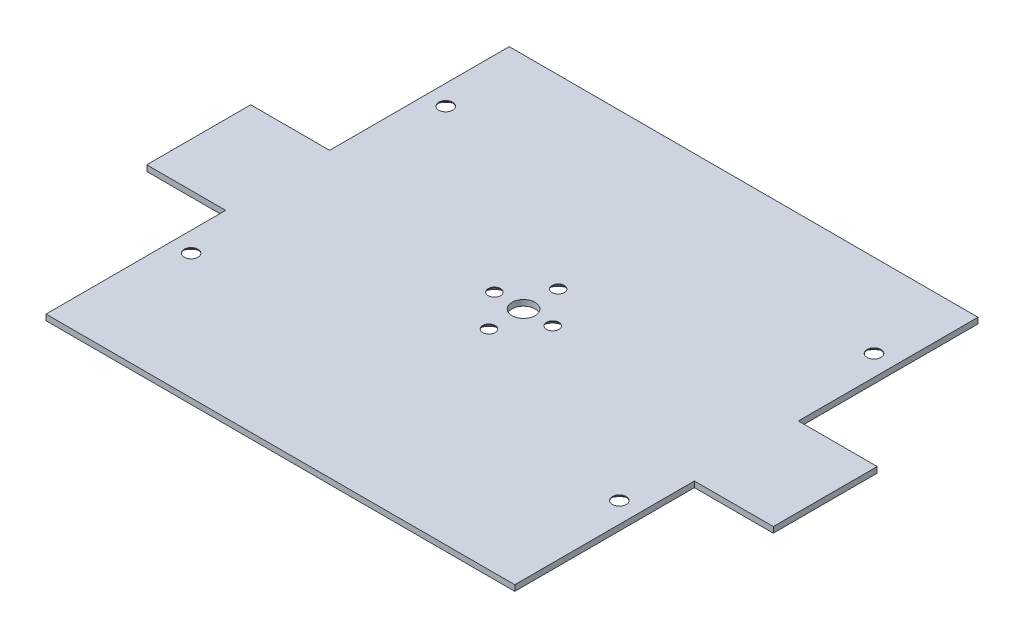
ISO-10303-21;
HEADER;
FILE_DESCRIPTION(('STEP AP214'),'2;1');
FILE_NAME('part.step','',(''),(''),'','','');
FILE_SCHEMA(('AUTOMOTIVE_DESIGN { 1 0 10303 214 1 1 1 1 }'));
ENDSEC;
DATA;
#1=APPLICATION_CONTEXT('core data for automotive mechanical design processes');
#2=APPLICATION_PROTOCOL_DEFINITION('international standard','automotive_design',2000,#1);
#3=PRODUCT_CONTEXT('',#1,'mechanical');
#4=PRODUCT('Part','Part','',(#3));
#5=PRODUCT_RELATED_PRODUCT_CATEGORY('part','',(#4));
#6=PRODUCT_DEFINITION_FORMATION('','',#4);
#7=PRODUCT_DEFINITION_CONTEXT('part definition',#1,'design');
#8=PRODUCT_DEFINITION('design','',#6,#7);
#9=PRODUCT_DEFINITION_SHAPE('','',#8);
#10=(LENGTH_UNIT() NAMED_UNIT(*) SI_UNIT(.MILLI.,.METRE.));
#11=(NAMED_UNIT(*) PLANE_ANGLE_UNIT() SI_UNIT($,.RADIAN.));
#12=(NAMED_UNIT(*) SI_UNIT($,.STERADIAN.) SOLID_ANGLE_UNIT());
#13=UNCERTAINTY_MEASURE_WITH_UNIT(LENGTH_MEASURE(1.E-05),#10,'distance_accuracy_value','');
#14=(GEOMETRIC_REPRESENTATION_CONTEXT(3) GLOBAL_UNCERTAINTY_ASSIGNED_CONTEXT((#13)) GLOBAL_UNIT_ASSIGNED_CONTEXT((#10,
#11,#12)) REPRESENTATION_CONTEXT('',''));
#15=CARTESIAN_POINT('',(0.,0.,0.));
#16=DIRECTION('',(0.,0.,1.));
#17=DIRECTION('',(1.,0.,0.));
#18=AXIS2_PLACEMENT_3D('',#15,#16,#17);
#19=CARTESIAN_POINT('',(-64.29375,1.5875,63.53175));
#20=DIRECTION('',(1.,0.,0.));
#21=DIRECTION('',(0.,0.,-1.));
#22=AXIS2_PLACEMENT_3D('',#19,#20,#21);
#23=PLANE('',#22);
#24=DIRECTION('',(0.,0.,1.));
#25=VECTOR('',#24,1.);
#26=CARTESIAN_POINT('',(-64.29375,0.,63.53175));
#27=LINE('',#26,#25);
#28=CARTESIAN_POINT('',(-64.29375,0.,14.25575));
#29=VERTEX_POINT('',#28);
#30=CARTESIAN_POINT('',(-64.29375,0.,63.53175));
#31=VERTEX_POINT('',#30);
#32=EDGE_CURVE('E212',#29,#31,#27,.T.);
#33=ORIENTED_EDGE('',*,*,#32,.T.);
#34=DIRECTION('',(0.,-1.,0.));
#35=VECTOR('',#34,1.);
#36=CARTESIAN_POINT('',(-64.29375,1.5875,63.53175));
#37=LINE('',#36,#35);
#38=CARTESIAN_POINT('',(-64.29375,1.5875,63.53175));
#39=VERTEX_POINT('',#38);
#40=EDGE_CURVE('E12',#39,#31,#37,.T.);
#41=ORIENTED_EDGE('',*,*,#40,.F.);
#42=DIRECTION('',(0.,0.,1.));
#43=VECTOR('',#42,1.);
#44=CARTESIAN_POINT('',(-64.29375,1.5875,63.53175));
#45=LINE('',#44,#43);
#46=CARTESIAN_POINT('',(-64.29375,1.5875,14.25575));
#47=VERTEX_POINT('',#46);
#48=EDGE_CURVE('E204',#47,#39,#45,.T.);
#49=ORIENTED_EDGE('',*,*,#48,.F.);
#50=DIRECTION('',(0.,-1.,0.));
#51=VECTOR('',#50,1.);
#52=CARTESIAN_POINT('',(-64.29375,1.5875,14.25575));
#53=LINE('',#52,#51);
#54=EDGE_CURVE('E157',#47,#29,#53,.T.);
#55=ORIENTED_EDGE('',*,*,#54,.T.);
#56=EDGE_LOOP('',(#33,#41,#49,#55));
#57=FACE_BOUND('',#56,.T.);
#58=ADVANCED_FACE('F38',(#57),#23,.F.);
#59=CARTESIAN_POINT('',(-64.29375,1.5875,63.53175));
#60=DIRECTION('',(0.,0.,-1.));
#61=DIRECTION('',(-1.,0.,0.));
#62=AXIS2_PLACEMENT_3D('',#59,#60,#61);
#63=PLANE('',#62);
#64=DIRECTION('',(1.,0.,0.));
#65=VECTOR('',#64,1.);
#66=CARTESIAN_POINT('',(-64.29375,0.,63.53175));
#67=LINE('',#66,#65);
#68=CARTESIAN_POINT('',(64.29375,0.,63.53175));
#69=VERTEX_POINT('',#68);
#70=EDGE_CURVE('E273',#31,#69,#67,.T.);
#71=ORIENTED_EDGE('',*,*,#70,.T.);
#72=DIRECTION('',(0.,-1.,0.));
#73=VECTOR('',#72,1.);
#74=CARTESIAN_POINT('',(64.29375,1.5875,63.53175));
#75=LINE('',#74,#73);
#76=CARTESIAN_POINT('',(64.29375,1.5875,63.53175));
#77=VERTEX_POINT('',#76);
#78=EDGE_CURVE('E46',#77,#69,#75,.T.);
#79=ORIENTED_EDGE('',*,*,#78,.F.);
#80=DIRECTION('',(1.,0.,0.));
#81=VECTOR('',#80,1.);
#82=CARTESIAN_POINT('',(-64.29375,1.5875,63.53175));
#83=LINE('',#82,#81);
#84=EDGE_CURVE('E109',#39,#77,#83,.T.);
#85=ORIENTED_EDGE('',*,*,#84,.F.);
#86=ORIENTED_EDGE('',*,*,#40,.T.);
#87=EDGE_LOOP('',(#71,#79,#85,#86));
#88=FACE_BOUND('',#87,.T.);
#89=ADVANCED_FACE('F262',(#88),#63,.F.);
#90=CARTESIAN_POINT('',(64.29375,1.5875,63.53175));
#91=DIRECTION('',(-1.,0.,0.));
#92=DIRECTION('',(0.,0.,1.));
#93=AXIS2_PLACEMENT_3D('',#90,#91,#92);
#94=PLANE('',#93);
#95=DIRECTION('',(0.,0.,-1.));
#96=VECTOR('',#95,1.);
#97=CARTESIAN_POINT('',(64.29375,0.,63.53175));
#98=LINE('',#97,#96);
#99=CARTESIAN_POINT('',(64.29375,0.,14.25575));
#100=VERTEX_POINT('',#99);
#101=EDGE_CURVE('E274',#69,#100,#98,.T.);
#102=ORIENTED_EDGE('',*,*,#101,.T.);
#103=DIRECTION('',(0.,-1.,0.));
#104=VECTOR('',#103,1.);
#105=CARTESIAN_POINT('',(64.29375,1.5875,14.25575));
#106=LINE('',#105,#104);
#107=CARTESIAN_POINT('',(64.29375,1.5875,14.25575));
#108=VERTEX_POINT('',#107);
#109=EDGE_CURVE('E311',#108,#100,#106,.T.);
#110=ORIENTED_EDGE('',*,*,#109,.F.);
#111=DIRECTION('',(0.,0.,-1.));
#112=VECTOR('',#111,1.);
#113=CARTESIAN_POINT('',(64.29375,1.5875,63.53175));
#114=LINE('',#113,#112);
#115=EDGE_CURVE('E193',#77,#108,#114,.T.);
#116=ORIENTED_EDGE('',*,*,#115,.F.);
#117=ORIENTED_EDGE('',*,*,#78,.T.);
#118=EDGE_LOOP('',(#102,#110,#116,#117));
#119=FACE_BOUND('',#118,.T.);
#120=ADVANCED_FACE('F267',(#119),#94,.F.);
#121=CARTESIAN_POINT('',(85.931375,1.5875,14.25575));
#122=DIRECTION('',(0.,0.,-1.));
#123=DIRECTION('',(-1.,0.,0.));
#124=AXIS2_PLACEMENT_3D('',#121,#122,#123);
#125=PLANE('',#124);
#126=DIRECTION('',(1.,0.,0.));
#127=VECTOR('',#126,1.);
#128=CARTESIAN_POINT('',(85.931375,0.,14.25575));
#129=LINE('',#128,#127);
#130=CARTESIAN_POINT('',(85.931375,0.,14.25575));
#131=VERTEX_POINT('',#130);
#132=EDGE_CURVE('E278',#100,#131,#129,.T.);
#133=ORIENTED_EDGE('',*,*,#132,.T.);
#134=DIRECTION('',(0.,-1.,0.));
#135=VECTOR('',#134,1.);
#136=CARTESIAN_POINT('',(85.931375,1.5875,14.25575));
#137=LINE('',#136,#135);
#138=CARTESIAN_POINT('',(85.931375,1.5875,14.25575));
#139=VERTEX_POINT('',#138);
#140=EDGE_CURVE('E308',#139,#131,#137,.T.);
#141=ORIENTED_EDGE('',*,*,#140,.F.);
#142=DIRECTION('',(1.,0.,0.));
#143=VECTOR('',#142,1.);
#144=CARTESIAN_POINT('',(85.931375,1.5875,14.25575));
#145=LINE('',#144,#143);
#146=EDGE_CURVE('E189',#108,#139,#145,.T.);
#147=ORIENTED_EDGE('',*,*,#146,.F.);
#148=ORIENTED_EDGE('',*,*,#109,.T.);
#149=EDGE_LOOP('',(#133,#141,#147,#148));
#150=FACE_BOUND('',#149,.T.);
#151=ADVANCED_FACE('F324',(#150),#125,.F.);
#152=CARTESIAN_POINT('',(85.931375,1.5875,-14.25575));
#153=DIRECTION('',(-1.,0.,0.));
#154=DIRECTION('',(0.,0.,1.));
#155=AXIS2_PLACEMENT_3D('',#152,#153,#154);
#156=PLANE('',#155);
#157=DIRECTION('',(0.,0.,-1.));
#158=VECTOR('',#157,1.);
#159=CARTESIAN_POINT('',(85.931375,0.,-14.25575));
#160=LINE('',#159,#158);
#161=CARTESIAN_POINT('',(85.931375,0.,-14.25575));
#162=VERTEX_POINT('',#161);
#163=EDGE_CURVE('E280',#131,#162,#160,.T.);
#164=ORIENTED_EDGE('',*,*,#163,.T.);
#165=DIRECTION('',(0.,-1.,0.));
#166=VECTOR('',#165,1.);
#167=CARTESIAN_POINT('',(85.931375,1.5875,-14.25575));
#168=LINE('',#167,#166);
#169=CARTESIAN_POINT('',(85.931375,1.5875,-14.25575));
#170=VERTEX_POINT('',#169);
#171=EDGE_CURVE('E305',#170,#162,#168,.T.);
#172=ORIENTED_EDGE('',*,*,#171,.F.);
#173=DIRECTION('',(0.,0.,-1.));
#174=VECTOR('',#173,1.);
#175=CARTESIAN_POINT('',(85.931375,1.5875,-14.25575));
#176=LINE('',#175,#174);
#177=EDGE_CURVE('E186',#139,#170,#176,.T.);
#178=ORIENTED_EDGE('',*,*,#177,.F.);
#179=ORIENTED_EDGE('',*,*,#140,.T.);
#180=EDGE_LOOP('',(#164,#172,#178,#179));
#181=FACE_BOUND('',#180,.T.);
#182=ADVANCED_FACE('F328',(#181),#156,.F.);
#183=CARTESIAN_POINT('',(85.931375,1.5875,-14.25575));
#184=DIRECTION('',(0.,0.,1.));
#185=DIRECTION('',(1.,0.,0.));
#186=AXIS2_PLACEMENT_3D('',#183,#184,#185);
#187=PLANE('',#186);
#188=DIRECTION('',(-1.,0.,0.));
#189=VECTOR('',#188,1.);
#190=CARTESIAN_POINT('',(85.931375,0.,-14.25575));
#191=LINE('',#190,#189);
#192=CARTESIAN_POINT('',(64.29375,0.,-14.25575));
#193=VERTEX_POINT('',#192);
#194=EDGE_CURVE('E282',#162,#193,#191,.T.);
#195=ORIENTED_EDGE('',*,*,#194,.T.);
#196=DIRECTION('',(0.,-1.,0.));
#197=VECTOR('',#196,1.);
#198=CARTESIAN_POINT('',(64.29375,1.5875,-14.25575));
#199=LINE('',#198,#197);
#200=CARTESIAN_POINT('',(64.29375,1.5875,-14.25575));
#201=VERTEX_POINT('',#200);
#202=EDGE_CURVE('E302',#201,#193,#199,.T.);
#203=ORIENTED_EDGE('',*,*,#202,.F.);
#204=DIRECTION('',(-1.,0.,0.));
#205=VECTOR('',#204,1.);
#206=CARTESIAN_POINT('',(85.931375,1.5875,-14.25575));
#207=LINE('',#206,#205);
#208=EDGE_CURVE('E178',#170,#201,#207,.T.);
#209=ORIENTED_EDGE('',*,*,#208,.F.);
#210=ORIENTED_EDGE('',*,*,#171,.T.);
#211=EDGE_LOOP('',(#195,#203,#209,#210));
#212=FACE_BOUND('',#211,.T.);
#213=ADVANCED_FACE('F511',(#212),#187,.F.);
#214=CARTESIAN_POINT('',(64.29375,1.5875,-63.53175));
#215=DIRECTION('',(-1.,0.,0.));
#216=DIRECTION('',(0.,0.,1.));
#217=AXIS2_PLACEMENT_3D('',#214,#215,#216);
#218=PLANE('',#217);
#219=DIRECTION('',(0.,0.,-1.));
#220=VECTOR('',#219,1.);
#221=CARTESIAN_POINT('',(64.29375,0.,-63.53175));
#222=LINE('',#221,#220);
#223=CARTESIAN_POINT('',(64.29375,0.,-63.53175));
#224=VERTEX_POINT('',#223);
#225=EDGE_CURVE('E284',#193,#224,#222,.T.);
#226=ORIENTED_EDGE('',*,*,#225,.T.);
#227=DIRECTION('',(0.,-1.,0.));
#228=VECTOR('',#227,1.);
#229=CARTESIAN_POINT('',(64.29375,1.5875,-63.53175));
#230=LINE('',#229,#228);
#231=CARTESIAN_POINT('',(64.29375,1.5875,-63.53175));
#232=VERTEX_POINT('',#231);
#233=EDGE_CURVE('E299',#232,#224,#230,.T.);
#234=ORIENTED_EDGE('',*,*,#233,.F.);
#235=DIRECTION('',(0.,0.,-1.));
#236=VECTOR('',#235,1.);
#237=CARTESIAN_POINT('',(64.29375,1.5875,-63.53175));
#238=LINE('',#237,#236);
#239=EDGE_CURVE('E174',#201,#232,#238,.T.);
#240=ORIENTED_EDGE('',*,*,#239,.F.);
#241=ORIENTED_EDGE('',*,*,#202,.T.);
#242=EDGE_LOOP('',(#226,#234,#240,#241));
#243=FACE_BOUND('',#242,.T.);
#244=ADVANCED_FACE('F507',(#243),#218,.F.);
#245=CARTESIAN_POINT('',(-64.29375,1.5875,-63.53175));
#246=DIRECTION('',(0.,0.,1.));
#247=DIRECTION('',(1.,0.,0.));
#248=AXIS2_PLACEMENT_3D('',#245,#246,#247);
#249=PLANE('',#248);
#250=DIRECTION('',(-1.,0.,0.));
#251=VECTOR('',#250,1.);
#252=CARTESIAN_POINT('',(-64.29375,0.,-63.53175));
#253=LINE('',#252,#251);
#254=CARTESIAN_POINT('',(-64.29375,0.,-63.53175));
#255=VERTEX_POINT('',#254);
#256=EDGE_CURVE('E286',#224,#255,#253,.T.);
#257=ORIENTED_EDGE('',*,*,#256,.T.);
#258=DIRECTION('',(0.,-1.,0.));
#259=VECTOR('',#258,1.);
#260=CARTESIAN_POINT('',(-64.29375,1.5875,-63.53175));
#261=LINE('',#260,#259);
#262=CARTESIAN_POINT('',(-64.29375,1.5875,-63.53175));
#263=VERTEX_POINT('',#262);
#264=EDGE_CURVE('E296',#263,#255,#261,.T.);
#265=ORIENTED_EDGE('',*,*,#264,.F.);
#266=DIRECTION('',(-1.,0.,0.));
#267=VECTOR('',#266,1.);
#268=CARTESIAN_POINT('',(-64.29375,1.5875,-63.53175));
#269=LINE('',#268,#267);
#270=EDGE_CURVE('E170',#232,#263,#269,.T.);
#271=ORIENTED_EDGE('',*,*,#270,.F.);
#272=ORIENTED_EDGE('',*,*,#233,.T.);
#273=EDGE_LOOP('',(#257,#265,#271,#272));
#274=FACE_BOUND('',#273,.T.);
#275=ADVANCED_FACE('F503',(#274),#249,.F.);
#276=CARTESIAN_POINT('',(-64.29375,1.5875,-63.53175));
#277=DIRECTION('',(1.,0.,0.));
#278=DIRECTION('',(0.,0.,-1.));
#279=AXIS2_PLACEMENT_3D('',#276,#277,#278);
#280=PLANE('',#279);
#281=DIRECTION('',(0.,0.,1.));
#282=VECTOR('',#281,1.);
#283=CARTESIAN_POINT('',(-64.29375,0.,-63.53175));
#284=LINE('',#283,#282);
#285=CARTESIAN_POINT('',(-64.29375,0.,-14.25575));
#286=VERTEX_POINT('',#285);
#287=EDGE_CURVE('E288',#255,#286,#284,.T.);
#288=ORIENTED_EDGE('',*,*,#287,.T.);
#289=DIRECTION('',(0.,-1.,0.));
#290=VECTOR('',#289,1.);
#291=CARTESIAN_POINT('',(-64.29375,1.5875,-14.25575));
#292=LINE('',#291,#290);
#293=CARTESIAN_POINT('',(-64.29375,1.5875,-14.25575));
#294=VERTEX_POINT('',#293);
#295=EDGE_CURVE('E150',#294,#286,#292,.T.);
#296=ORIENTED_EDGE('',*,*,#295,.F.);
#297=DIRECTION('',(0.,0.,1.));
#298=VECTOR('',#297,1.);
#299=CARTESIAN_POINT('',(-64.29375,1.5875,-63.53175));
#300=LINE('',#299,#298);
#301=EDGE_CURVE('E140',#263,#294,#300,.T.);
#302=ORIENTED_EDGE('',*,*,#301,.F.);
#303=ORIENTED_EDGE('',*,*,#264,.T.);
#304=EDGE_LOOP('',(#288,#296,#302,#303));
#305=FACE_BOUND('',#304,.T.);
#306=ADVANCED_FACE('F500',(#305),#280,.F.);
#307=CARTESIAN_POINT('',(-85.931375,1.5875,-14.25575));
#308=DIRECTION('',(0.,0.,1.));
#309=DIRECTION('',(1.,0.,0.));
#310=AXIS2_PLACEMENT_3D('',#307,#308,#309);
#311=PLANE('',#310);
#312=DIRECTION('',(-1.,0.,0.));
#313=VECTOR('',#312,1.);
#314=CARTESIAN_POINT('',(-85.931375,0.,-14.25575));
#315=LINE('',#314,#313);
#316=CARTESIAN_POINT('',(-85.931375,0.,-14.25575));
#317=VERTEX_POINT('',#316);
#318=EDGE_CURVE('E149',#286,#317,#315,.T.);
#319=ORIENTED_EDGE('',*,*,#318,.T.);
#320=DIRECTION('',(0.,-1.,0.));
#321=VECTOR('',#320,1.);
#322=CARTESIAN_POINT('',(-85.931375,1.5875,-14.25575));
#323=LINE('',#322,#321);
#324=CARTESIAN_POINT('',(-85.931375,1.5875,-14.25575));
#325=VERTEX_POINT('',#324);
#326=EDGE_CURVE('E146',#325,#317,#323,.T.);
#327=ORIENTED_EDGE('',*,*,#326,.F.);
#328=DIRECTION('',(-1.,0.,0.));
#329=VECTOR('',#328,1.);
#330=CARTESIAN_POINT('',(-85.931375,1.5875,-14.25575));
#331=LINE('',#330,#329);
#332=EDGE_CURVE('E134',#294,#325,#331,.T.);
#333=ORIENTED_EDGE('',*,*,#332,.F.);
#334=ORIENTED_EDGE('',*,*,#295,.T.);
#335=EDGE_LOOP('',(#319,#327,#333,#334));
#336=FACE_BOUND('',#335,.T.);
#337=ADVANCED_FACE('F147',(#336),#311,.F.);
#338=CARTESIAN_POINT('',(-85.931375,1.5875,-14.25575));
#339=DIRECTION('',(1.,0.,0.));
#340=DIRECTION('',(0.,0.,-1.));
#341=AXIS2_PLACEMENT_3D('',#338,#339,#340);
#342=PLANE('',#341);
#343=DIRECTION('',(0.,0.,1.));
#344=VECTOR('',#343,1.);
#345=CARTESIAN_POINT('',(-85.931375,0.,-14.25575));
#346=LINE('',#345,#344);
#347=CARTESIAN_POINT('',(-85.931375,0.,14.25575));
#348=VERTEX_POINT('',#347);
#349=EDGE_CURVE('E95',#317,#348,#346,.T.);
#350=ORIENTED_EDGE('',*,*,#349,.T.);
#351=DIRECTION('',(0.,-1.,0.));
#352=VECTOR('',#351,1.);
#353=CARTESIAN_POINT('',(-85.931375,1.5875,14.25575));
#354=LINE('',#353,#352);
#355=CARTESIAN_POINT('',(-85.931375,1.5875,14.25575));
#356=VERTEX_POINT('',#355);
#357=EDGE_CURVE('E151',#356,#348,#354,.T.);
#358=ORIENTED_EDGE('',*,*,#357,.F.);
#359=DIRECTION('',(0.,0.,1.));
#360=VECTOR('',#359,1.);
#361=CARTESIAN_POINT('',(-85.931375,1.5875,-14.25575));
#362=LINE('',#361,#360);
#363=EDGE_CURVE('E138',#325,#356,#362,.T.);
#364=ORIENTED_EDGE('',*,*,#363,.F.);
#365=ORIENTED_EDGE('',*,*,#326,.T.);
#366=EDGE_LOOP('',(#350,#358,#364,#365));
#367=FACE_BOUND('',#366,.T.);
#368=ADVANCED_FACE('F153',(#367),#342,.F.);
#369=CARTESIAN_POINT('',(-85.931375,1.5875,14.25575));
#370=DIRECTION('',(0.,0.,-1.));
#371=DIRECTION('',(-1.,0.,0.));
#372=AXIS2_PLACEMENT_3D('',#369,#370,#371);
#373=PLANE('',#372);
#374=DIRECTION('',(1.,0.,0.));
#375=VECTOR('',#374,1.);
#376=CARTESIAN_POINT('',(-85.931375,0.,14.25575));
#377=LINE('',#376,#375);
#378=EDGE_CURVE('E101',#348,#29,#377,.T.);
#379=ORIENTED_EDGE('',*,*,#378,.T.);
#380=ORIENTED_EDGE('',*,*,#54,.F.);
#381=DIRECTION('',(1.,0.,0.));
#382=VECTOR('',#381,1.);
#383=CARTESIAN_POINT('',(-85.931375,1.5875,14.25575));
#384=LINE('',#383,#382);
#385=EDGE_CURVE('E54',#356,#47,#384,.T.);
#386=ORIENTED_EDGE('',*,*,#385,.F.);
#387=ORIENTED_EDGE('',*,*,#357,.T.);
#388=EDGE_LOOP('',(#379,#380,#386,#387));
#389=FACE_BOUND('',#388,.T.);
#390=ADVANCED_FACE('F492',(#389),#373,.F.);
#391=CARTESIAN_POINT('',(0.,1.5875,0.));
#392=DIRECTION('',(0.,-1.,0.));
#393=DIRECTION('',(0.,0.,-1.));
#394=AXIS2_PLACEMENT_3D('',#391,#392,#393);
#395=PLANE('',#394);
#396=CARTESIAN_POINT('',(8.,1.5875,-3.175));
#397=DIRECTION('',(0.,-1.,0.));
#398=DIRECTION('',(0.,0.,-1.));
#399=AXIS2_PLACEMENT_3D('',#396,#397,#398);
#400=CIRCLE('',#399,1.7);
#401=CARTESIAN_POINT('',(8.,1.5875,-4.875));
#402=VERTEX_POINT('',#401);
#403=EDGE_CURVE('E363',#402,#402,#400,.T.);
#404=ORIENTED_EDGE('',*,*,#403,.T.);
#405=EDGE_LOOP('',(#404));
#406=FACE_BOUND('',#405,.T.);
#407=CARTESIAN_POINT('',(-8.,1.5875,-3.175));
#408=DIRECTION('',(0.,-1.,0.));
#409=DIRECTION('',(0.,0.,-1.));
#410=AXIS2_PLACEMENT_3D('',#407,#408,#409);
#411=CIRCLE('',#410,1.7);
#412=CARTESIAN_POINT('',(-8.,1.5875,-4.875));
#413=VERTEX_POINT('',#412);
#414=EDGE_CURVE('E357',#413,#413,#411,.T.);
#415=ORIENTED_EDGE('',*,*,#414,.T.);
#416=EDGE_LOOP('',(#415));
#417=FACE_BOUND('',#416,.T.);
#418=CARTESIAN_POINT('',(0.,1.5875,-12.675));
#419=DIRECTION('',(0.,-1.,0.));
#420=DIRECTION('',(0.,0.,-1.));
#421=AXIS2_PLACEMENT_3D('',#418,#419,#420);
#422=CIRCLE('',#421,1.7);
#423=CARTESIAN_POINT('',(0.,1.5875,-14.375));
#424=VERTEX_POINT('',#423);
#425=EDGE_CURVE('E351',#424,#424,#422,.T.);
#426=ORIENTED_EDGE('',*,*,#425,.T.);
#427=EDGE_LOOP('',(#426));
#428=FACE_BOUND('',#427,.T.);
#429=CARTESIAN_POINT('',(0.,1.5875,6.325));
#430=DIRECTION('',(0.,-1.,0.));
#431=DIRECTION('',(0.,0.,-1.));
#432=AXIS2_PLACEMENT_3D('',#429,#430,#431);
#433=CIRCLE('',#432,1.7);
#434=CARTESIAN_POINT('',(0.,1.5875,4.625));
#435=VERTEX_POINT('',#434);
#436=EDGE_CURVE('E346',#435,#435,#433,.T.);
#437=ORIENTED_EDGE('',*,*,#436,.T.);
#438=EDGE_LOOP('',(#437));
#439=FACE_BOUND('',#438,.T.);
#440=CARTESIAN_POINT('',(0.,1.5875,-3.175));
#441=DIRECTION('',(0.,-1.,0.));
#442=DIRECTION('',(0.,0.,-1.));
#443=AXIS2_PLACEMENT_3D('',#440,#441,#442);
#444=CIRCLE('',#443,3.175);
#445=CARTESIAN_POINT('',(0.,1.5875,-6.35));
#446=VERTEX_POINT('',#445);
#447=EDGE_CURVE('E340',#446,#446,#444,.T.);
#448=ORIENTED_EDGE('',*,*,#447,.T.);
#449=EDGE_LOOP('',(#448));
#450=FACE_BOUND('',#449,.T.);
#451=CARTESIAN_POINT('',(-58.8486249999998,1.5875,29.17825));
#452=DIRECTION('',(0.,-1.,0.));
#453=DIRECTION('',(0.,0.,-1.));
#454=AXIS2_PLACEMENT_3D('',#451,#452,#453);
#455=CIRCLE('',#454,1.89865);
#456=CARTESIAN_POINT('',(-58.8486249999998,1.5875,27.2796));
#457=VERTEX_POINT('',#456);
#458=EDGE_CURVE('E335',#457,#457,#455,.T.);
#459=ORIENTED_EDGE('',*,*,#458,.T.);
#460=EDGE_LOOP('',(#459));
#461=FACE_BOUND('',#460,.T.);
#462=CARTESIAN_POINT('',(-58.8486249999998,1.5875,-40.67175));
#463=DIRECTION('',(0.,-1.,0.));
#464=DIRECTION('',(0.,0.,-1.));
#465=AXIS2_PLACEMENT_3D('',#462,#463,#464);
#466=CIRCLE('',#465,1.89865);
#467=CARTESIAN_POINT('',(-58.8486249999998,1.5875,-42.5704));
#468=VERTEX_POINT('',#467);
#469=EDGE_CURVE('E231',#468,#468,#466,.T.);
#470=ORIENTED_EDGE('',*,*,#469,.T.);
#471=EDGE_LOOP('',(#470));
#472=FACE_BOUND('',#471,.T.);
#473=CARTESIAN_POINT('',(58.6263750000002,1.5875,-40.67175));
#474=DIRECTION('',(0.,-1.,0.));
#475=DIRECTION('',(0.,0.,-1.));
#476=AXIS2_PLACEMENT_3D('',#473,#474,#475);
#477=CIRCLE('',#476,1.89865);
#478=CARTESIAN_POINT('',(58.6263750000002,1.5875,-42.5704));
#479=VERTEX_POINT('',#478);
#480=EDGE_CURVE('E219',#479,#479,#477,.T.);
#481=ORIENTED_EDGE('',*,*,#480,.T.);
#482=EDGE_LOOP('',(#481));
#483=FACE_BOUND('',#482,.T.);
#484=CARTESIAN_POINT('',(58.6263750000002,1.5875,29.17825));
#485=DIRECTION('',(0.,-1.,0.));
#486=DIRECTION('',(0.,0.,-1.));
#487=AXIS2_PLACEMENT_3D('',#484,#485,#486);
#488=CIRCLE('',#487,1.89865);
#489=CARTESIAN_POINT('',(58.6263750000002,1.5875,27.2796));
#490=VERTEX_POINT('',#489);
#491=EDGE_CURVE('E207',#490,#490,#488,.T.);
#492=ORIENTED_EDGE('',*,*,#491,.T.);
#493=EDGE_LOOP('',(#492));
#494=FACE_BOUND('',#493,.T.);
#495=ORIENTED_EDGE('',*,*,#48,.T.);
#496=ORIENTED_EDGE('',*,*,#84,.T.);
#497=ORIENTED_EDGE('',*,*,#115,.T.);
#498=ORIENTED_EDGE('',*,*,#146,.T.);
#499=ORIENTED_EDGE('',*,*,#177,.T.);
#500=ORIENTED_EDGE('',*,*,#208,.T.);
#501=ORIENTED_EDGE('',*,*,#239,.T.);
#502=ORIENTED_EDGE('',*,*,#270,.T.);
#503=ORIENTED_EDGE('',*,*,#301,.T.);
#504=ORIENTED_EDGE('',*,*,#332,.T.);
#505=ORIENTED_EDGE('',*,*,#363,.T.);
#506=ORIENTED_EDGE('',*,*,#385,.T.);
#507=EDGE_LOOP('',(#495,#496,#497,#498,#499,#500,#501,#502,#503,#504,#505,#506));
#508=FACE_BOUND('',#507,.T.);
#509=ADVANCED_FACE('F136',(#406,#417,#428,#439,#450,#461,#472,#483,#494,#508),#395,.F.);
#510=CARTESIAN_POINT('',(0.,0.,0.));
#511=DIRECTION('',(0.,-1.,0.));
#512=DIRECTION('',(0.,0.,-1.));
#513=AXIS2_PLACEMENT_3D('',#510,#511,#512);
#514=PLANE('',#513);
#515=CARTESIAN_POINT('',(8.,0.,-3.175));
#516=DIRECTION('',(0.,-1.,0.));
#517=DIRECTION('',(0.,0.,-1.));
#518=AXIS2_PLACEMENT_3D('',#515,#516,#517);
#519=CIRCLE('',#518,3.15);
#520=CARTESIAN_POINT('',(8.,0.,-6.325));
#521=VERTEX_POINT('',#520);
#522=EDGE_CURVE('E373',#521,#521,#519,.T.);
#523=ORIENTED_EDGE('',*,*,#522,.F.);
#524=EDGE_LOOP('',(#523));
#525=FACE_BOUND('',#524,.T.);
#526=CARTESIAN_POINT('',(-8.,0.,-3.175));
#527=DIRECTION('',(0.,-1.,0.));
#528=DIRECTION('',(0.,0.,-1.));
#529=AXIS2_PLACEMENT_3D('',#526,#527,#528);
#530=CIRCLE('',#529,3.15);
#531=CARTESIAN_POINT('',(-8.,0.,-6.325));
#532=VERTEX_POINT('',#531);
#533=EDGE_CURVE('E365',#532,#532,#530,.T.);
#534=ORIENTED_EDGE('',*,*,#533,.F.);
#535=EDGE_LOOP('',(#534));
#536=FACE_BOUND('',#535,.T.);
#537=CARTESIAN_POINT('',(0.,0.,-12.675));
#538=DIRECTION('',(0.,-1.,0.));
#539=DIRECTION('',(0.,0.,-1.));
#540=AXIS2_PLACEMENT_3D('',#537,#538,#539);
#541=CIRCLE('',#540,3.15);
#542=CARTESIAN_POINT('',(0.,0.,-15.825));
#543=VERTEX_POINT('',#542);
#544=EDGE_CURVE('E360',#543,#543,#541,.T.);
#545=ORIENTED_EDGE('',*,*,#544,.F.);
#546=EDGE_LOOP('',(#545));
#547=FACE_BOUND('',#546,.T.);
#548=CARTESIAN_POINT('',(0.,0.,6.325));
#549=DIRECTION('',(0.,-1.,0.));
#550=DIRECTION('',(0.,0.,-1.));
#551=AXIS2_PLACEMENT_3D('',#548,#549,#550);
#552=CIRCLE('',#551,3.15);
#553=CARTESIAN_POINT('',(0.,0.,3.175));
#554=VERTEX_POINT('',#553);
#555=EDGE_CURVE('E354',#554,#554,#552,.T.);
#556=ORIENTED_EDGE('',*,*,#555,.F.);
#557=EDGE_LOOP('',(#556));
#558=FACE_BOUND('',#557,.T.);
#559=CARTESIAN_POINT('',(0.,0.,-3.175));
#560=DIRECTION('',(0.,-1.,0.));
#561=DIRECTION('',(0.,0.,-1.));
#562=AXIS2_PLACEMENT_3D('',#559,#560,#561);
#563=CIRCLE('',#562,3.175);
#564=CARTESIAN_POINT('',(0.,0.,-6.35));
#565=VERTEX_POINT('',#564);
#566=EDGE_CURVE('E344',#565,#565,#563,.T.);
#567=ORIENTED_EDGE('',*,*,#566,.F.);
#568=EDGE_LOOP('',(#567));
#569=FACE_BOUND('',#568,.T.);
#570=CARTESIAN_POINT('',(-58.8486249999998,0.,29.17825));
#571=DIRECTION('',(0.,-1.,0.));
#572=DIRECTION('',(0.,0.,-1.));
#573=AXIS2_PLACEMENT_3D('',#570,#571,#572);
#574=CIRCLE('',#573,3.5433);
#575=CARTESIAN_POINT('',(-58.8486249999998,0.,25.63495));
#576=VERTEX_POINT('',#575);
#577=EDGE_CURVE('E343',#576,#576,#574,.T.);
#578=ORIENTED_EDGE('',*,*,#577,.F.);
#579=EDGE_LOOP('',(#578));
#580=FACE_BOUND('',#579,.T.);
#581=CARTESIAN_POINT('',(-58.8486249999998,0.,-40.67175));
#582=DIRECTION('',(0.,-1.,0.));
#583=DIRECTION('',(0.,0.,-1.));
#584=AXIS2_PLACEMENT_3D('',#581,#582,#583);
#585=CIRCLE('',#584,3.5433);
#586=CARTESIAN_POINT('',(-58.8486249999998,0.,-44.21505));
#587=VERTEX_POINT('',#586);
#588=EDGE_CURVE('E338',#587,#587,#585,.T.);
#589=ORIENTED_EDGE('',*,*,#588,.F.);
#590=EDGE_LOOP('',(#589));
#591=FACE_BOUND('',#590,.T.);
#592=CARTESIAN_POINT('',(58.6263750000002,0.,-40.67175));
#593=DIRECTION('',(0.,-1.,0.));
#594=DIRECTION('',(0.,0.,-1.));
#595=AXIS2_PLACEMENT_3D('',#592,#593,#594);
#596=CIRCLE('',#595,3.5433);
#597=CARTESIAN_POINT('',(58.6263750000002,0.,-44.21505));
#598=VERTEX_POINT('',#597);
#599=EDGE_CURVE('E236',#598,#598,#596,.T.);
#600=ORIENTED_EDGE('',*,*,#599,.F.);
#601=EDGE_LOOP('',(#600));
#602=FACE_BOUND('',#601,.T.);
#603=CARTESIAN_POINT('',(58.6263750000002,0.,29.17825));
#604=DIRECTION('',(0.,-1.,0.));
#605=DIRECTION('',(0.,0.,-1.));
#606=AXIS2_PLACEMENT_3D('',#603,#604,#605);
#607=CIRCLE('',#606,3.5433);
#608=CARTESIAN_POINT('',(58.6263750000002,0.,25.63495));
#609=VERTEX_POINT('',#608);
#610=EDGE_CURVE('E216',#609,#609,#607,.T.);
#611=ORIENTED_EDGE('',*,*,#610,.F.);
#612=EDGE_LOOP('',(#611));
#613=FACE_BOUND('',#612,.T.);
#614=ORIENTED_EDGE('',*,*,#32,.F.);
#615=ORIENTED_EDGE('',*,*,#378,.F.);
#616=ORIENTED_EDGE('',*,*,#349,.F.);
#617=ORIENTED_EDGE('',*,*,#318,.F.);
#618=ORIENTED_EDGE('',*,*,#287,.F.);
#619=ORIENTED_EDGE('',*,*,#256,.F.);
#620=ORIENTED_EDGE('',*,*,#225,.F.);
#621=ORIENTED_EDGE('',*,*,#194,.F.);
#622=ORIENTED_EDGE('',*,*,#163,.F.);
#623=ORIENTED_EDGE('',*,*,#132,.F.);
#624=ORIENTED_EDGE('',*,*,#101,.F.);
#625=ORIENTED_EDGE('',*,*,#70,.F.);
#626=EDGE_LOOP('',(#614,#615,#616,#617,#618,#619,#620,#621,#622,#623,#624,#625));
#627=FACE_BOUND('',#626,.T.);
#628=ADVANCED_FACE('F319',(#525,#536,#547,#558,#569,#580,#591,#602,#613,#627),#514,.T.);
#629=CARTESIAN_POINT('',(58.6263750000002,0.,29.17825));
#630=DIRECTION('',(0.,-1.,0.));
#631=DIRECTION('',(0.,0.,-1.));
#632=AXIS2_PLACEMENT_3D('',#629,#630,#631);
#633=CYLINDRICAL_SURFACE('',#632,1.89864999999999);
#634=ORIENTED_EDGE('',*,*,#491,.F.);
#635=EDGE_LOOP('',(#634));
#636=FACE_BOUND('',#635,.T.);
#637=CARTESIAN_POINT('',(58.6263750000002,1.38002520841571,29.17825));
#638=DIRECTION('',(0.,-1.,0.));
#639=DIRECTION('',(0.,0.,-1.));
#640=AXIS2_PLACEMENT_3D('',#637,#638,#639);
#641=CIRCLE('',#640,1.89864999999999);
#642=CARTESIAN_POINT('',(58.6263750000002,1.38002520841571,27.2796));
#643=VERTEX_POINT('',#642);
#644=EDGE_CURVE('E213',#643,#643,#641,.T.);
#645=ORIENTED_EDGE('',*,*,#644,.T.);
#646=EDGE_LOOP('',(#645));
#647=FACE_BOUND('',#646,.T.);
#648=ADVANCED_FACE('F465',(#636,#647),#633,.F.);
#649=CARTESIAN_POINT('',(58.6263750000002,0.,29.17825));
#650=DIRECTION('',(0.,-1.,0.));
#651=DIRECTION('',(0.,0.,-1.));
#652=AXIS2_PLACEMENT_3D('',#649,#650,#651);
#653=CONICAL_SURFACE('',#652,3.5433,0.872664625997169);
#654=ORIENTED_EDGE('',*,*,#644,.F.);
#655=EDGE_LOOP('',(#654));
#656=FACE_BOUND('',#655,.T.);
#657=ORIENTED_EDGE('',*,*,#610,.T.);
#658=EDGE_LOOP('',(#657));
#659=FACE_BOUND('',#658,.T.);
#660=ADVANCED_FACE('F258',(#656,#659),#653,.F.);
#661=CARTESIAN_POINT('',(58.6263750000002,0.,-40.67175));
#662=DIRECTION('',(0.,-1.,0.));
#663=DIRECTION('',(0.,0.,-1.));
#664=AXIS2_PLACEMENT_3D('',#661,#662,#663);
#665=CYLINDRICAL_SURFACE('',#664,1.89864999999999);
#666=ORIENTED_EDGE('',*,*,#480,.F.);
#667=EDGE_LOOP('',(#666));
#668=FACE_BOUND('',#667,.T.);
#669=CARTESIAN_POINT('',(58.6263750000002,1.38002520841571,-40.67175));
#670=DIRECTION('',(0.,-1.,0.));
#671=DIRECTION('',(0.,0.,-1.));
#672=AXIS2_PLACEMENT_3D('',#669,#670,#671);
#673=CIRCLE('',#672,1.89864999999999);
#674=CARTESIAN_POINT('',(58.6263750000002,1.38002520841571,-42.5704));
#675=VERTEX_POINT('',#674);
#676=EDGE_CURVE('E224',#675,#675,#673,.T.);
#677=ORIENTED_EDGE('',*,*,#676,.T.);
#678=EDGE_LOOP('',(#677));
#679=FACE_BOUND('',#678,.T.);
#680=ADVANCED_FACE('F245',(#668,#679),#665,.F.);
#681=CARTESIAN_POINT('',(58.6263750000002,0.,-40.67175));
#682=DIRECTION('',(0.,-1.,0.));
#683=DIRECTION('',(0.,0.,-1.));
#684=AXIS2_PLACEMENT_3D('',#681,#682,#683);
#685=CONICAL_SURFACE('',#684,3.5433,0.872664625997169);
#686=ORIENTED_EDGE('',*,*,#676,.F.);
#687=EDGE_LOOP('',(#686));
#688=FACE_BOUND('',#687,.T.);
#689=ORIENTED_EDGE('',*,*,#599,.T.);
#690=EDGE_LOOP('',(#689));
#691=FACE_BOUND('',#690,.T.);
#692=ADVANCED_FACE('F247',(#688,#691),#685,.F.);
#693=CARTESIAN_POINT('',(-58.8486249999998,0.,-40.67175));
#694=DIRECTION('',(0.,-1.,0.));
#695=DIRECTION('',(0.,0.,-1.));
#696=AXIS2_PLACEMENT_3D('',#693,#694,#695);
#697=CYLINDRICAL_SURFACE('',#696,1.89864999999999);
#698=ORIENTED_EDGE('',*,*,#469,.F.);
#699=EDGE_LOOP('',(#698));
#700=FACE_BOUND('',#699,.T.);
#701=CARTESIAN_POINT('',(-58.8486249999998,1.38002520841571,-40.67175));
#702=DIRECTION('',(0.,-1.,0.));
#703=DIRECTION('',(0.,0.,-1.));
#704=AXIS2_PLACEMENT_3D('',#701,#702,#703);
#705=CIRCLE('',#704,1.89864999999999);
#706=CARTESIAN_POINT('',(-58.8486249999998,1.38002520841571,-42.5704));
#707=VERTEX_POINT('',#706);
#708=EDGE_CURVE('E237',#707,#707,#705,.T.);
#709=ORIENTED_EDGE('',*,*,#708,.T.);
#710=EDGE_LOOP('',(#709));
#711=FACE_BOUND('',#710,.T.);
#712=ADVANCED_FACE('F249',(#700,#711),#697,.F.);
#713=CARTESIAN_POINT('',(-58.8486249999998,0.,-40.67175));
#714=DIRECTION('',(0.,-1.,0.));
#715=DIRECTION('',(0.,0.,-1.));
#716=AXIS2_PLACEMENT_3D('',#713,#714,#715);
#717=CONICAL_SURFACE('',#716,3.5433,0.872664625997169);
#718=ORIENTED_EDGE('',*,*,#708,.F.);
#719=EDGE_LOOP('',(#718));
#720=FACE_BOUND('',#719,.T.);
#721=ORIENTED_EDGE('',*,*,#588,.T.);
#722=EDGE_LOOP('',(#721));
#723=FACE_BOUND('',#722,.T.);
#724=ADVANCED_FACE('F255',(#720,#723),#717,.F.);
#725=CARTESIAN_POINT('',(-58.8486249999998,0.,29.17825));
#726=DIRECTION('',(0.,-1.,0.));
#727=DIRECTION('',(0.,0.,-1.));
#728=AXIS2_PLACEMENT_3D('',#725,#726,#727);
#729=CYLINDRICAL_SURFACE('',#728,1.89864999999999);
#730=ORIENTED_EDGE('',*,*,#458,.F.);
#731=EDGE_LOOP('',(#730));
#732=FACE_BOUND('',#731,.T.);
#733=CARTESIAN_POINT('',(-58.8486249999998,1.38002520841571,29.17825));
#734=DIRECTION('',(0.,-1.,0.));
#735=DIRECTION('',(0.,0.,-1.));
#736=AXIS2_PLACEMENT_3D('',#733,#734,#735);
#737=CIRCLE('',#736,1.89864999999999);
#738=CARTESIAN_POINT('',(-58.8486249999998,1.38002520841571,27.2796));
#739=VERTEX_POINT('',#738);
#740=EDGE_CURVE('E339',#739,#739,#737,.T.);
#741=ORIENTED_EDGE('',*,*,#740,.T.);
#742=EDGE_LOOP('',(#741));
#743=FACE_BOUND('',#742,.T.);
#744=ADVANCED_FACE('F409',(#732,#743),#729,.F.);
#745=CARTESIAN_POINT('',(-58.8486249999998,0.,29.17825));
#746=DIRECTION('',(0.,-1.,0.));
#747=DIRECTION('',(0.,0.,-1.));
#748=AXIS2_PLACEMENT_3D('',#745,#746,#747);
#749=CONICAL_SURFACE('',#748,3.5433,0.872664625997169);
#750=ORIENTED_EDGE('',*,*,#740,.F.);
#751=EDGE_LOOP('',(#750));
#752=FACE_BOUND('',#751,.T.);
#753=ORIENTED_EDGE('',*,*,#577,.T.);
#754=EDGE_LOOP('',(#753));
#755=FACE_BOUND('',#754,.T.);
#756=ADVANCED_FACE('F414',(#752,#755),#749,.F.);
#757=CARTESIAN_POINT('',(0.,1.5875,-3.175));
#758=DIRECTION('',(0.,-1.,0.));
#759=DIRECTION('',(0.,0.,-1.));
#760=AXIS2_PLACEMENT_3D('',#757,#758,#759);
#761=CYLINDRICAL_SURFACE('',#760,3.175);
#762=ORIENTED_EDGE('',*,*,#447,.F.);
#763=EDGE_LOOP('',(#762));
#764=FACE_BOUND('',#763,.T.);
#765=ORIENTED_EDGE('',*,*,#566,.T.);
#766=EDGE_LOOP('',(#765));
#767=FACE_BOUND('',#766,.T.);
#768=ADVANCED_FACE('F420',(#764,#767),#761,.F.);
#769=CARTESIAN_POINT('',(0.,0.,6.325));
#770=DIRECTION('',(0.,-1.,0.));
#771=DIRECTION('',(0.,0.,-1.));
#772=AXIS2_PLACEMENT_3D('',#769,#770,#771);
#773=CYLINDRICAL_SURFACE('',#772,1.7);
#774=ORIENTED_EDGE('',*,*,#436,.F.);
#775=EDGE_LOOP('',(#774));
#776=FACE_BOUND('',#775,.T.);
#777=CARTESIAN_POINT('',(0.,1.45,6.325));
#778=DIRECTION('',(0.,-1.,0.));
#779=DIRECTION('',(0.,0.,-1.));
#780=AXIS2_PLACEMENT_3D('',#777,#778,#779);
#781=CIRCLE('',#780,1.7);
#782=CARTESIAN_POINT('',(0.,1.45,4.625));
#783=VERTEX_POINT('',#782);
#784=EDGE_CURVE('E349',#783,#783,#781,.T.);
#785=ORIENTED_EDGE('',*,*,#784,.T.);
#786=EDGE_LOOP('',(#785));
#787=FACE_BOUND('',#786,.T.);
#788=ADVANCED_FACE('F424',(#776,#787),#773,.F.);
#789=CARTESIAN_POINT('',(0.,0.,6.325));
#790=DIRECTION('',(0.,-1.,0.));
#791=DIRECTION('',(0.,0.,-1.));
#792=AXIS2_PLACEMENT_3D('',#789,#790,#791);
#793=CONICAL_SURFACE('',#792,3.15,0.785398163397449);
#794=ORIENTED_EDGE('',*,*,#784,.F.);
#795=EDGE_LOOP('',(#794));
#796=FACE_BOUND('',#795,.T.);
#797=ORIENTED_EDGE('',*,*,#555,.T.);
#798=EDGE_LOOP('',(#797));
#799=FACE_BOUND('',#798,.T.);
#800=ADVANCED_FACE('F428',(#796,#799),#793,.F.);
#801=CARTESIAN_POINT('',(0.,0.,-12.675));
#802=DIRECTION('',(0.,-1.,0.));
#803=DIRECTION('',(0.,0.,-1.));
#804=AXIS2_PLACEMENT_3D('',#801,#802,#803);
#805=CYLINDRICAL_SURFACE('',#804,1.7);
#806=ORIENTED_EDGE('',*,*,#425,.F.);
#807=EDGE_LOOP('',(#806));
#808=FACE_BOUND('',#807,.T.);
#809=CARTESIAN_POINT('',(0.,1.45,-12.675));
#810=DIRECTION('',(0.,-1.,0.));
#811=DIRECTION('',(0.,0.,-1.));
#812=AXIS2_PLACEMENT_3D('',#809,#810,#811);
#813=CIRCLE('',#812,1.7);
#814=CARTESIAN_POINT('',(0.,1.45,-14.375));
#815=VERTEX_POINT('',#814);
#816=EDGE_CURVE('E355',#815,#815,#813,.T.);
#817=ORIENTED_EDGE('',*,*,#816,.T.);
#818=EDGE_LOOP('',(#817));
#819=FACE_BOUND('',#818,.T.);
#820=ADVANCED_FACE('F432',(#808,#819),#805,.F.);
#821=CARTESIAN_POINT('',(0.,0.,-12.675));
#822=DIRECTION('',(0.,-1.,0.));
#823=DIRECTION('',(0.,0.,-1.));
#824=AXIS2_PLACEMENT_3D('',#821,#822,#823);
#825=CONICAL_SURFACE('',#824,3.15,0.785398163397449);
#826=ORIENTED_EDGE('',*,*,#816,.F.);
#827=EDGE_LOOP('',(#826));
#828=FACE_BOUND('',#827,.T.);
#829=ORIENTED_EDGE('',*,*,#544,.T.);
#830=EDGE_LOOP('',(#829));
#831=FACE_BOUND('',#830,.T.);
#832=ADVANCED_FACE('F436',(#828,#831),#825,.F.);
#833=CARTESIAN_POINT('',(-8.,0.,-3.175));
#834=DIRECTION('',(0.,-1.,0.));
#835=DIRECTION('',(0.,0.,-1.));
#836=AXIS2_PLACEMENT_3D('',#833,#834,#835);
#837=CYLINDRICAL_SURFACE('',#836,1.7);
#838=ORIENTED_EDGE('',*,*,#414,.F.);
#839=EDGE_LOOP('',(#838));
#840=FACE_BOUND('',#839,.T.);
#841=CARTESIAN_POINT('',(-8.,1.45,-3.175));
#842=DIRECTION('',(0.,-1.,0.));
#843=DIRECTION('',(0.,0.,-1.));
#844=AXIS2_PLACEMENT_3D('',#841,#842,#843);
#845=CIRCLE('',#844,1.7);
#846=CARTESIAN_POINT('',(-8.,1.45,-4.875));
#847=VERTEX_POINT('',#846);
#848=EDGE_CURVE('E361',#847,#847,#845,.T.);
#849=ORIENTED_EDGE('',*,*,#848,.T.);
#850=EDGE_LOOP('',(#849));
#851=FACE_BOUND('',#850,.T.);
#852=ADVANCED_FACE('F440',(#840,#851),#837,.F.);
#853=CARTESIAN_POINT('',(-8.,0.,-3.175));
#854=DIRECTION('',(0.,-1.,0.));
#855=DIRECTION('',(0.,0.,-1.));
#856=AXIS2_PLACEMENT_3D('',#853,#854,#855);
#857=CONICAL_SURFACE('',#856,3.15,0.785398163397449);
#858=ORIENTED_EDGE('',*,*,#848,.F.);
#859=EDGE_LOOP('',(#858));
#860=FACE_BOUND('',#859,.T.);
#861=ORIENTED_EDGE('',*,*,#533,.T.);
#862=EDGE_LOOP('',(#861));
#863=FACE_BOUND('',#862,.T.);
#864=ADVANCED_FACE('F444',(#860,#863),#857,.F.);
#865=CARTESIAN_POINT('',(8.,0.,-3.175));
#866=DIRECTION('',(0.,-1.,0.));
#867=DIRECTION('',(0.,0.,-1.));
#868=AXIS2_PLACEMENT_3D('',#865,#866,#867);
#869=CYLINDRICAL_SURFACE('',#868,1.7);
#870=ORIENTED_EDGE('',*,*,#403,.F.);
#871=EDGE_LOOP('',(#870));
#872=FACE_BOUND('',#871,.T.);
#873=CARTESIAN_POINT('',(8.,1.45,-3.175));
#874=DIRECTION('',(0.,-1.,0.));
#875=DIRECTION('',(0.,0.,-1.));
#876=AXIS2_PLACEMENT_3D('',#873,#874,#875);
#877=CIRCLE('',#876,1.7);
#878=CARTESIAN_POINT('',(8.,1.45,-4.875));
#879=VERTEX_POINT('',#878);
#880=EDGE_CURVE('E366',#879,#879,#877,.T.);
#881=ORIENTED_EDGE('',*,*,#880,.T.);
#882=EDGE_LOOP('',(#881));
#883=FACE_BOUND('',#882,.T.);
#884=ADVANCED_FACE('F448',(#872,#883),#869,.F.);
#885=CARTESIAN_POINT('',(8.,0.,-3.175));
#886=DIRECTION('',(0.,-1.,0.));
#887=DIRECTION('',(0.,0.,-1.));
#888=AXIS2_PLACEMENT_3D('',#885,#886,#887);
#889=CONICAL_SURFACE('',#888,3.15,0.785398163397448);
#890=ORIENTED_EDGE('',*,*,#880,.F.);
#891=EDGE_LOOP('',(#890));
#892=FACE_BOUND('',#891,.T.);
#893=ORIENTED_EDGE('',*,*,#522,.T.);
#894=EDGE_LOOP('',(#893));
#895=FACE_BOUND('',#894,.T.);
#896=ADVANCED_FACE('F452',(#892,#895),#889,.F.);
#897=CLOSED_SHELL('',(#58,#89,#120,#151,#182,#213,#244,#275,#306,#337,#368,#390,#509,#628,#648,
#660,#680,#692,#712,#724,#744,#756,#768,#788,#800,#820,#832,#852,#864,#884,#896));
#898=MANIFOLD_SOLID_BREP('B2',#897);
#899=ADVANCED_BREP_SHAPE_REPRESENTATION('',(#18,#898),#14);
#900=SHAPE_DEFINITION_REPRESENTATION(#9,#899);
ENDSEC;
END-ISO-10303-21;
